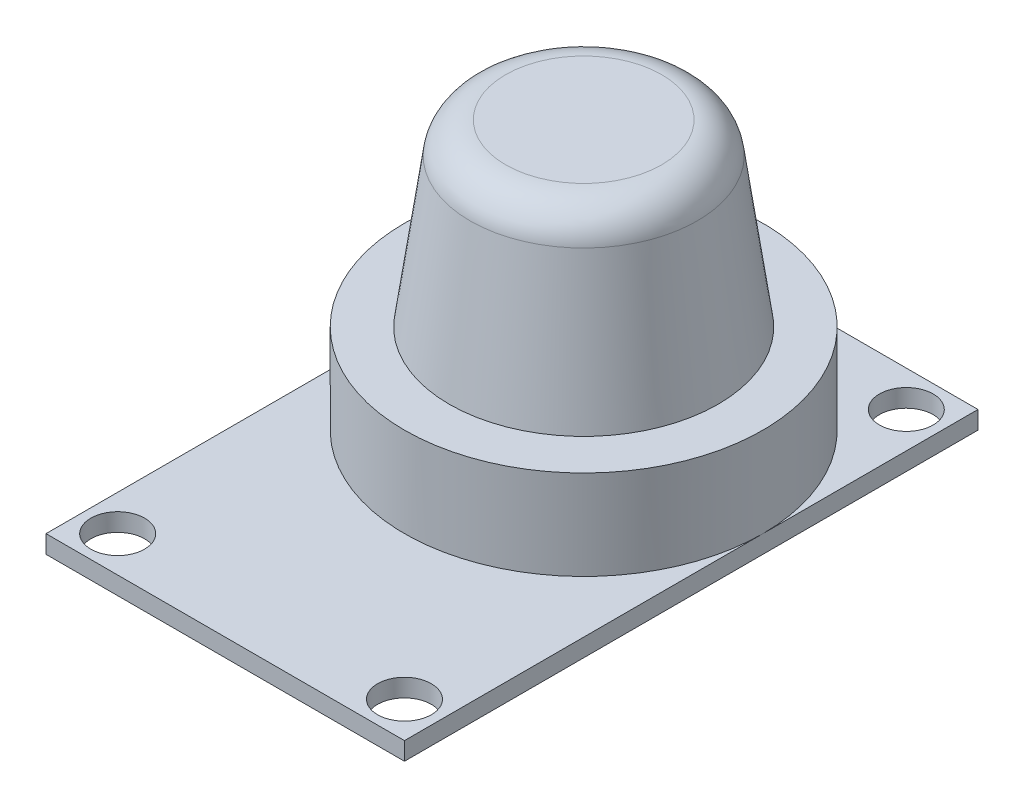
ISO-10303-21;
HEADER;
FILE_DESCRIPTION(('STEP AP214'),'2;1');
FILE_NAME('part.step','',(''),(''),'','','');
FILE_SCHEMA(('AUTOMOTIVE_DESIGN { 1 0 10303 214 1 1 1 1 }'));
ENDSEC;
DATA;
#1=APPLICATION_CONTEXT('core data for automotive mechanical design processes');
#2=APPLICATION_PROTOCOL_DEFINITION('international standard','automotive_design',2000,#1);
#3=PRODUCT_CONTEXT('',#1,'mechanical');
#4=PRODUCT('Part','Part','',(#3));
#5=PRODUCT_RELATED_PRODUCT_CATEGORY('part','',(#4));
#6=PRODUCT_DEFINITION_FORMATION('','',#4);
#7=PRODUCT_DEFINITION_CONTEXT('part definition',#1,'design');
#8=PRODUCT_DEFINITION('design','',#6,#7);
#9=PRODUCT_DEFINITION_SHAPE('','',#8);
#10=(LENGTH_UNIT() NAMED_UNIT(*) SI_UNIT(.MILLI.,.METRE.));
#11=(NAMED_UNIT(*) PLANE_ANGLE_UNIT() SI_UNIT($,.RADIAN.));
#12=(NAMED_UNIT(*) SI_UNIT($,.STERADIAN.) SOLID_ANGLE_UNIT());
#13=UNCERTAINTY_MEASURE_WITH_UNIT(LENGTH_MEASURE(1.E-05),#10,'distance_accuracy_value','');
#14=(GEOMETRIC_REPRESENTATION_CONTEXT(3) GLOBAL_UNCERTAINTY_ASSIGNED_CONTEXT((#13)) GLOBAL_UNIT_ASSIGNED_CONTEXT((#10,
#11,#12)) REPRESENTATION_CONTEXT('',''));
#15=CARTESIAN_POINT('',(0.,0.,0.));
#16=DIRECTION('',(0.,0.,1.));
#17=DIRECTION('',(1.,0.,0.));
#18=AXIS2_PLACEMENT_3D('',#15,#16,#17);
#19=CARTESIAN_POINT('',(0.,1.,0.));
#20=DIRECTION('',(0.,1.,0.));
#21=DIRECTION('',(0.,0.,1.));
#22=AXIS2_PLACEMENT_3D('',#19,#20,#21);
#23=PLANE('',#22);
#24=CARTESIAN_POINT('',(-8.00000000000001,1.,-14.));
#25=DIRECTION('',(0.,1.,0.));
#26=DIRECTION('',(0.,0.,1.));
#27=AXIS2_PLACEMENT_3D('',#24,#25,#26);
#28=CIRCLE('',#27,1.5);
#29=CARTESIAN_POINT('',(-8.00000000000001,1.,-12.5));
#30=VERTEX_POINT('',#29);
#31=EDGE_CURVE('E186',#30,#30,#28,.T.);
#32=ORIENTED_EDGE('',*,*,#31,.F.);
#33=EDGE_LOOP('',(#32));
#34=FACE_BOUND('',#33,.T.);
#35=CARTESIAN_POINT('',(8.,1.,-14.));
#36=DIRECTION('',(0.,1.,0.));
#37=DIRECTION('',(0.,0.,1.));
#38=AXIS2_PLACEMENT_3D('',#35,#36,#37);
#39=CIRCLE('',#38,1.5);
#40=CARTESIAN_POINT('',(8.,1.,-12.5));
#41=VERTEX_POINT('',#40);
#42=EDGE_CURVE('E135',#41,#41,#39,.T.);
#43=ORIENTED_EDGE('',*,*,#42,.F.);
#44=EDGE_LOOP('',(#43));
#45=FACE_BOUND('',#44,.T.);
#46=CARTESIAN_POINT('',(0.,1.,-4.));
#47=DIRECTION('',(0.,1.,0.));
#48=DIRECTION('',(0.,0.,1.));
#49=AXIS2_PLACEMENT_3D('',#46,#47,#48);
#50=CIRCLE('',#49,10.);
#51=CARTESIAN_POINT('',(10.,1.,-4.));
#52=VERTEX_POINT('',#51);
#53=CARTESIAN_POINT('',(-10.,1.,-4.));
#54=VERTEX_POINT('',#53);
#55=EDGE_CURVE('E98',#52,#54,#50,.T.);
#56=ORIENTED_EDGE('',*,*,#55,.F.);
#57=DIRECTION('',(0.,0.,-1.));
#58=VECTOR('',#57,1.);
#59=CARTESIAN_POINT('',(10.,1.,-16.));
#60=LINE('',#59,#58);
#61=CARTESIAN_POINT('',(10.,1.,-16.));
#62=VERTEX_POINT('',#61);
#63=EDGE_CURVE('E82',#52,#62,#60,.T.);
#64=ORIENTED_EDGE('',*,*,#63,.T.);
#65=DIRECTION('',(-1.,0.,0.));
#66=VECTOR('',#65,1.);
#67=CARTESIAN_POINT('',(-10.,1.,-16.));
#68=LINE('',#67,#66);
#69=CARTESIAN_POINT('',(-10.,1.,-16.));
#70=VERTEX_POINT('',#69);
#71=EDGE_CURVE('E89',#62,#70,#68,.T.);
#72=ORIENTED_EDGE('',*,*,#71,.T.);
#73=DIRECTION('',(0.,0.,1.));
#74=VECTOR('',#73,1.);
#75=CARTESIAN_POINT('',(-10.,1.,-16.));
#76=LINE('',#75,#74);
#77=EDGE_CURVE('E100',#70,#54,#76,.T.);
#78=ORIENTED_EDGE('',*,*,#77,.T.);
#79=EDGE_LOOP('',(#56,#64,#72,#78));
#80=FACE_BOUND('',#79,.T.);
#81=ADVANCED_FACE('F32',(#34,#45,#80),#23,.T.);
#82=CARTESIAN_POINT('',(10.,1.,-16.));
#83=DIRECTION('',(-1.,0.,0.));
#84=DIRECTION('',(0.,0.,1.));
#85=AXIS2_PLACEMENT_3D('',#82,#83,#84);
#86=PLANE('',#85);
#87=DIRECTION('',(0.,0.,-1.));
#88=VECTOR('',#87,1.);
#89=CARTESIAN_POINT('',(10.,0.,-16.));
#90=LINE('',#89,#88);
#91=CARTESIAN_POINT('',(10.,0.,16.));
#92=VERTEX_POINT('',#91);
#93=CARTESIAN_POINT('',(10.,0.,-16.));
#94=VERTEX_POINT('',#93);
#95=EDGE_CURVE('E119',#92,#94,#90,.T.);
#96=ORIENTED_EDGE('',*,*,#95,.T.);
#97=DIRECTION('',(0.,-1.,0.));
#98=VECTOR('',#97,1.);
#99=CARTESIAN_POINT('',(10.,1.,-16.));
#100=LINE('',#99,#98);
#101=EDGE_CURVE('E95',#62,#94,#100,.T.);
#102=ORIENTED_EDGE('',*,*,#101,.F.);
#103=ORIENTED_EDGE('',*,*,#63,.F.);
#104=CARTESIAN_POINT('',(10.,1.,16.));
#105=VERTEX_POINT('',#104);
#106=EDGE_CURVE('E86',#105,#52,#60,.T.);
#107=ORIENTED_EDGE('',*,*,#106,.F.);
#108=DIRECTION('',(0.,-1.,0.));
#109=VECTOR('',#108,1.);
#110=CARTESIAN_POINT('',(10.,1.,16.));
#111=LINE('',#110,#109);
#112=EDGE_CURVE('E118',#105,#92,#111,.T.);
#113=ORIENTED_EDGE('',*,*,#112,.T.);
#114=EDGE_LOOP('',(#96,#102,#103,#107,#113));
#115=FACE_BOUND('',#114,.T.);
#116=ADVANCED_FACE('F93',(#115),#86,.F.);
#117=CARTESIAN_POINT('',(-10.,1.,-16.));
#118=DIRECTION('',(0.,0.,1.));
#119=DIRECTION('',(1.,0.,0.));
#120=AXIS2_PLACEMENT_3D('',#117,#118,#119);
#121=PLANE('',#120);
#122=DIRECTION('',(-1.,0.,0.));
#123=VECTOR('',#122,1.);
#124=CARTESIAN_POINT('',(-10.,0.,-16.));
#125=LINE('',#124,#123);
#126=CARTESIAN_POINT('',(-10.,0.,-16.));
#127=VERTEX_POINT('',#126);
#128=EDGE_CURVE('E121',#94,#127,#125,.T.);
#129=ORIENTED_EDGE('',*,*,#128,.T.);
#130=DIRECTION('',(0.,-1.,0.));
#131=VECTOR('',#130,1.);
#132=CARTESIAN_POINT('',(-10.,1.,-16.));
#133=LINE('',#132,#131);
#134=EDGE_CURVE('E109',#70,#127,#133,.T.);
#135=ORIENTED_EDGE('',*,*,#134,.F.);
#136=ORIENTED_EDGE('',*,*,#71,.F.);
#137=ORIENTED_EDGE('',*,*,#101,.T.);
#138=EDGE_LOOP('',(#129,#135,#136,#137));
#139=FACE_BOUND('',#138,.T.);
#140=ADVANCED_FACE('F161',(#139),#121,.F.);
#141=CARTESIAN_POINT('',(-10.,1.,-16.));
#142=DIRECTION('',(1.,0.,0.));
#143=DIRECTION('',(0.,0.,-1.));
#144=AXIS2_PLACEMENT_3D('',#141,#142,#143);
#145=PLANE('',#144);
#146=DIRECTION('',(0.,0.,1.));
#147=VECTOR('',#146,1.);
#148=CARTESIAN_POINT('',(-10.,0.,-16.));
#149=LINE('',#148,#147);
#150=CARTESIAN_POINT('',(-10.,0.,16.));
#151=VERTEX_POINT('',#150);
#152=EDGE_CURVE('E123',#127,#151,#149,.T.);
#153=ORIENTED_EDGE('',*,*,#152,.T.);
#154=DIRECTION('',(0.,-1.,0.));
#155=VECTOR('',#154,1.);
#156=CARTESIAN_POINT('',(-10.,1.,16.));
#157=LINE('',#156,#155);
#158=CARTESIAN_POINT('',(-10.,1.,16.));
#159=VERTEX_POINT('',#158);
#160=EDGE_CURVE('E127',#159,#151,#157,.T.);
#161=ORIENTED_EDGE('',*,*,#160,.F.);
#162=EDGE_CURVE('E115',#54,#159,#76,.T.);
#163=ORIENTED_EDGE('',*,*,#162,.F.);
#164=ORIENTED_EDGE('',*,*,#77,.F.);
#165=ORIENTED_EDGE('',*,*,#134,.T.);
#166=EDGE_LOOP('',(#153,#161,#163,#164,#165));
#167=FACE_BOUND('',#166,.T.);
#168=ADVANCED_FACE('F175',(#167),#145,.F.);
#169=CARTESIAN_POINT('',(-10.,1.,16.));
#170=DIRECTION('',(0.,0.,-1.));
#171=DIRECTION('',(-1.,0.,0.));
#172=AXIS2_PLACEMENT_3D('',#169,#170,#171);
#173=PLANE('',#172);
#174=DIRECTION('',(1.,0.,0.));
#175=VECTOR('',#174,1.);
#176=CARTESIAN_POINT('',(-10.,0.,16.));
#177=LINE('',#176,#175);
#178=EDGE_CURVE('E74',#151,#92,#177,.T.);
#179=ORIENTED_EDGE('',*,*,#178,.T.);
#180=ORIENTED_EDGE('',*,*,#112,.F.);
#181=DIRECTION('',(1.,0.,0.));
#182=VECTOR('',#181,1.);
#183=CARTESIAN_POINT('',(-10.,1.,16.));
#184=LINE('',#183,#182);
#185=EDGE_CURVE('E53',#159,#105,#184,.T.);
#186=ORIENTED_EDGE('',*,*,#185,.F.);
#187=ORIENTED_EDGE('',*,*,#160,.T.);
#188=EDGE_LOOP('',(#179,#180,#186,#187));
#189=FACE_BOUND('',#188,.T.);
#190=ADVANCED_FACE('F168',(#189),#173,.F.);
#191=CARTESIAN_POINT('',(8.,1.,14.));
#192=DIRECTION('',(0.,1.,0.));
#193=DIRECTION('',(0.,0.,-1.));
#194=AXIS2_PLACEMENT_3D('',#191,#192,#193);
#195=CIRCLE('',#194,1.5);
#196=CARTESIAN_POINT('',(8.,1.,12.5));
#197=VERTEX_POINT('',#196);
#198=EDGE_CURVE('E180',#197,#197,#195,.T.);
#199=ORIENTED_EDGE('',*,*,#198,.F.);
#200=EDGE_LOOP('',(#199));
#201=FACE_BOUND('',#200,.T.);
#202=CARTESIAN_POINT('',(-8.00000000000001,1.,14.));
#203=DIRECTION('',(0.,1.,0.));
#204=DIRECTION('',(0.,0.,-1.));
#205=AXIS2_PLACEMENT_3D('',#202,#203,#204);
#206=CIRCLE('',#205,1.5);
#207=CARTESIAN_POINT('',(-8.00000000000001,1.,12.5));
#208=VERTEX_POINT('',#207);
#209=EDGE_CURVE('E183',#208,#208,#206,.T.);
#210=ORIENTED_EDGE('',*,*,#209,.F.);
#211=EDGE_LOOP('',(#210));
#212=FACE_BOUND('',#211,.T.);
#213=EDGE_CURVE('E47',#54,#52,#50,.T.);
#214=ORIENTED_EDGE('',*,*,#213,.F.);
#215=ORIENTED_EDGE('',*,*,#162,.T.);
#216=ORIENTED_EDGE('',*,*,#185,.T.);
#217=ORIENTED_EDGE('',*,*,#106,.T.);
#218=EDGE_LOOP('',(#214,#215,#216,#217));
#219=FACE_BOUND('',#218,.T.);
#220=ADVANCED_FACE('F87',(#201,#212,#219),#23,.T.);
#221=CARTESIAN_POINT('',(0.,0.,0.));
#222=DIRECTION('',(0.,1.,0.));
#223=DIRECTION('',(0.,0.,1.));
#224=AXIS2_PLACEMENT_3D('',#221,#222,#223);
#225=PLANE('',#224);
#226=CARTESIAN_POINT('',(-8.00000000000001,0.,-14.));
#227=DIRECTION('',(0.,1.,0.));
#228=DIRECTION('',(0.,0.,1.));
#229=AXIS2_PLACEMENT_3D('',#226,#227,#228);
#230=CIRCLE('',#229,1.5);
#231=CARTESIAN_POINT('',(-8.00000000000001,0.,-12.5));
#232=VERTEX_POINT('',#231);
#233=EDGE_CURVE('E103',#232,#232,#230,.T.);
#234=ORIENTED_EDGE('',*,*,#233,.T.);
#235=EDGE_LOOP('',(#234));
#236=FACE_BOUND('',#235,.T.);
#237=CARTESIAN_POINT('',(8.,0.,14.));
#238=DIRECTION('',(0.,1.,0.));
#239=DIRECTION('',(0.,0.,1.));
#240=AXIS2_PLACEMENT_3D('',#237,#238,#239);
#241=CIRCLE('',#240,1.5);
#242=CARTESIAN_POINT('',(8.,0.,15.5));
#243=VERTEX_POINT('',#242);
#244=EDGE_CURVE('E138',#243,#243,#241,.T.);
#245=ORIENTED_EDGE('',*,*,#244,.T.);
#246=EDGE_LOOP('',(#245));
#247=FACE_BOUND('',#246,.T.);
#248=CARTESIAN_POINT('',(-8.00000000000001,0.,14.));
#249=DIRECTION('',(0.,1.,0.));
#250=DIRECTION('',(0.,0.,1.));
#251=AXIS2_PLACEMENT_3D('',#248,#249,#250);
#252=CIRCLE('',#251,1.5);
#253=CARTESIAN_POINT('',(-8.00000000000001,0.,15.5));
#254=VERTEX_POINT('',#253);
#255=EDGE_CURVE('E134',#254,#254,#252,.T.);
#256=ORIENTED_EDGE('',*,*,#255,.T.);
#257=EDGE_LOOP('',(#256));
#258=FACE_BOUND('',#257,.T.);
#259=CARTESIAN_POINT('',(8.,0.,-14.));
#260=DIRECTION('',(0.,1.,0.));
#261=DIRECTION('',(0.,0.,1.));
#262=AXIS2_PLACEMENT_3D('',#259,#260,#261);
#263=CIRCLE('',#262,1.5);
#264=CARTESIAN_POINT('',(8.,0.,-12.5));
#265=VERTEX_POINT('',#264);
#266=EDGE_CURVE('E131',#265,#265,#263,.T.);
#267=ORIENTED_EDGE('',*,*,#266,.T.);
#268=EDGE_LOOP('',(#267));
#269=FACE_BOUND('',#268,.T.);
#270=ORIENTED_EDGE('',*,*,#95,.F.);
#271=ORIENTED_EDGE('',*,*,#178,.F.);
#272=ORIENTED_EDGE('',*,*,#152,.F.);
#273=ORIENTED_EDGE('',*,*,#128,.F.);
#274=EDGE_LOOP('',(#270,#271,#272,#273));
#275=FACE_BOUND('',#274,.T.);
#276=ADVANCED_FACE('F167',(#236,#247,#258,#269,#275),#225,.F.);
#277=CARTESIAN_POINT('',(0.,6.,-4.));
#278=DIRECTION('',(0.,-1.,0.));
#279=DIRECTION('',(0.,0.,-1.));
#280=AXIS2_PLACEMENT_3D('',#277,#278,#279);
#281=CYLINDRICAL_SURFACE('',#280,10.);
#282=CARTESIAN_POINT('',(0.,6.,-4.));
#283=DIRECTION('',(0.,1.,0.));
#284=DIRECTION('',(0.,0.,1.));
#285=AXIS2_PLACEMENT_3D('',#282,#283,#284);
#286=CIRCLE('',#285,10.);
#287=CARTESIAN_POINT('',(0.,6.,6.));
#288=VERTEX_POINT('',#287);
#289=EDGE_CURVE('E102',#288,#288,#286,.T.);
#290=ORIENTED_EDGE('',*,*,#289,.F.);
#291=EDGE_LOOP('',(#290));
#292=FACE_BOUND('',#291,.T.);
#293=ORIENTED_EDGE('',*,*,#55,.T.);
#294=ORIENTED_EDGE('',*,*,#213,.T.);
#295=EDGE_LOOP('',(#293,#294));
#296=FACE_BOUND('',#295,.T.);
#297=ADVANCED_FACE('F105',(#292,#296),#281,.T.);
#298=CARTESIAN_POINT('',(0.,6.,-4.));
#299=DIRECTION('',(0.,1.,0.));
#300=DIRECTION('',(0.,0.,1.));
#301=AXIS2_PLACEMENT_3D('',#298,#299,#300);
#302=PLANE('',#301);
#303=CARTESIAN_POINT('',(0.,6.,-4.));
#304=DIRECTION('',(0.,1.,0.));
#305=DIRECTION('',(0.,0.,1.));
#306=AXIS2_PLACEMENT_3D('',#303,#304,#305);
#307=CIRCLE('',#306,7.5);
#308=CARTESIAN_POINT('',(0.,6.,3.5));
#309=VERTEX_POINT('',#308);
#310=EDGE_CURVE('E106',#309,#309,#307,.T.);
#311=ORIENTED_EDGE('',*,*,#310,.F.);
#312=EDGE_LOOP('',(#311));
#313=FACE_BOUND('',#312,.T.);
#314=ORIENTED_EDGE('',*,*,#289,.T.);
#315=EDGE_LOOP('',(#314));
#316=FACE_BOUND('',#315,.T.);
#317=ADVANCED_FACE('F197',(#313,#316),#302,.T.);
#318=CARTESIAN_POINT('',(8.,-4.,-14.));
#319=DIRECTION('',(0.,1.,0.));
#320=DIRECTION('',(0.,0.,1.));
#321=AXIS2_PLACEMENT_3D('',#318,#319,#320);
#322=CYLINDRICAL_SURFACE('',#321,1.5);
#323=ORIENTED_EDGE('',*,*,#42,.T.);
#324=EDGE_LOOP('',(#323));
#325=FACE_BOUND('',#324,.T.);
#326=ORIENTED_EDGE('',*,*,#266,.F.);
#327=EDGE_LOOP('',(#326));
#328=FACE_BOUND('',#327,.T.);
#329=ADVANCED_FACE('F193',(#325,#328),#322,.F.);
#330=CARTESIAN_POINT('',(-8.00000000000001,-4.,14.));
#331=DIRECTION('',(0.,1.,0.));
#332=DIRECTION('',(0.,0.,1.));
#333=AXIS2_PLACEMENT_3D('',#330,#331,#332);
#334=CYLINDRICAL_SURFACE('',#333,1.5);
#335=ORIENTED_EDGE('',*,*,#209,.T.);
#336=EDGE_LOOP('',(#335));
#337=FACE_BOUND('',#336,.T.);
#338=ORIENTED_EDGE('',*,*,#255,.F.);
#339=EDGE_LOOP('',(#338));
#340=FACE_BOUND('',#339,.T.);
#341=ADVANCED_FACE('F196',(#337,#340),#334,.F.);
#342=CARTESIAN_POINT('',(8.,-4.,14.));
#343=DIRECTION('',(0.,1.,0.));
#344=DIRECTION('',(0.,0.,1.));
#345=AXIS2_PLACEMENT_3D('',#342,#343,#344);
#346=CYLINDRICAL_SURFACE('',#345,1.5);
#347=ORIENTED_EDGE('',*,*,#198,.T.);
#348=EDGE_LOOP('',(#347));
#349=FACE_BOUND('',#348,.T.);
#350=ORIENTED_EDGE('',*,*,#244,.F.);
#351=EDGE_LOOP('',(#350));
#352=FACE_BOUND('',#351,.T.);
#353=ADVANCED_FACE('F277',(#349,#352),#346,.F.);
#354=CARTESIAN_POINT('',(-8.00000000000001,-4.,-14.));
#355=DIRECTION('',(0.,1.,0.));
#356=DIRECTION('',(0.,0.,1.));
#357=AXIS2_PLACEMENT_3D('',#354,#355,#356);
#358=CYLINDRICAL_SURFACE('',#357,1.5);
#359=ORIENTED_EDGE('',*,*,#31,.T.);
#360=EDGE_LOOP('',(#359));
#361=FACE_BOUND('',#360,.T.);
#362=ORIENTED_EDGE('',*,*,#233,.F.);
#363=EDGE_LOOP('',(#362));
#364=FACE_BOUND('',#363,.T.);
#365=ADVANCED_FACE('F285',(#361,#364),#358,.F.);
#366=CARTESIAN_POINT('',(0.,6.,-4.));
#367=DIRECTION('',(0.,-1.,0.));
#368=DIRECTION('',(0.,0.,1.));
#369=AXIS2_PLACEMENT_3D('',#366,#367,#368);
#370=CONICAL_SURFACE('',#369,7.5,0.139626340159546);
#371=CARTESIAN_POINT('',(0.,14.2783462019201,-4.));
#372=DIRECTION('',(0.,-1.,0.));
#373=DIRECTION('',(0.,0.,-1.));
#374=AXIS2_PLACEMENT_3D('',#371,#372,#373);
#375=CIRCLE('',#374,6.33655431482677);
#376=CARTESIAN_POINT('',(0.,14.2783462019201,-10.3365543148268));
#377=VERTEX_POINT('',#376);
#378=EDGE_CURVE('E11',#377,#377,#375,.T.);
#379=ORIENTED_EDGE('',*,*,#378,.T.);
#380=EDGE_LOOP('',(#379));
#381=FACE_BOUND('',#380,.T.);
#382=ORIENTED_EDGE('',*,*,#310,.T.);
#383=EDGE_LOOP('',(#382));
#384=FACE_BOUND('',#383,.T.);
#385=ADVANCED_FACE('F152',(#381,#384),#370,.T.);
#386=CARTESIAN_POINT('',(0.,16.,-4.));
#387=DIRECTION('',(0.,1.,0.));
#388=DIRECTION('',(0.,0.,1.));
#389=AXIS2_PLACEMENT_3D('',#386,#387,#388);
#390=PLANE('',#389);
#391=CARTESIAN_POINT('',(0.,16.,-4.));
#392=DIRECTION('',(0.,1.,0.));
#393=DIRECTION('',(0.,0.,1.));
#394=AXIS2_PLACEMENT_3D('',#391,#392,#393);
#395=CIRCLE('',#394,4.35601817734363);
#396=CARTESIAN_POINT('',(0.,16.,0.356018177343632));
#397=VERTEX_POINT('',#396);
#398=EDGE_CURVE('E40',#397,#397,#395,.T.);
#399=ORIENTED_EDGE('',*,*,#398,.T.);
#400=EDGE_LOOP('',(#399));
#401=FACE_BOUND('',#400,.T.);
#402=ADVANCED_FACE('F145',(#401),#390,.T.);
#403=CARTESIAN_POINT('',(0.,14.,-4.));
#404=DIRECTION('',(0.,1.,0.));
#405=DIRECTION('',(0.,0.,1.));
#406=AXIS2_PLACEMENT_3D('',#403,#404,#405);
#407=TOROIDAL_SURFACE('',#406,4.35601817734363,2.);
#408=ORIENTED_EDGE('',*,*,#378,.F.);
#409=EDGE_LOOP('',(#408));
#410=FACE_BOUND('',#409,.T.);
#411=ORIENTED_EDGE('',*,*,#398,.F.);
#412=EDGE_LOOP('',(#411));
#413=FACE_BOUND('',#412,.T.);
#414=ADVANCED_FACE('F34',(#410,#413),#407,.T.);
#415=CLOSED_SHELL('',(#81,#116,#140,#168,#190,#220,#276,#297,#317,#329,#341,#353,#365,#385,#402,#414));
#416=MANIFOLD_SOLID_BREP('B2',#415);
#417=ADVANCED_BREP_SHAPE_REPRESENTATION('',(#18,#416),#14);
#418=SHAPE_DEFINITION_REPRESENTATION(#9,#417);
ENDSEC;
END-ISO-10303-21;
